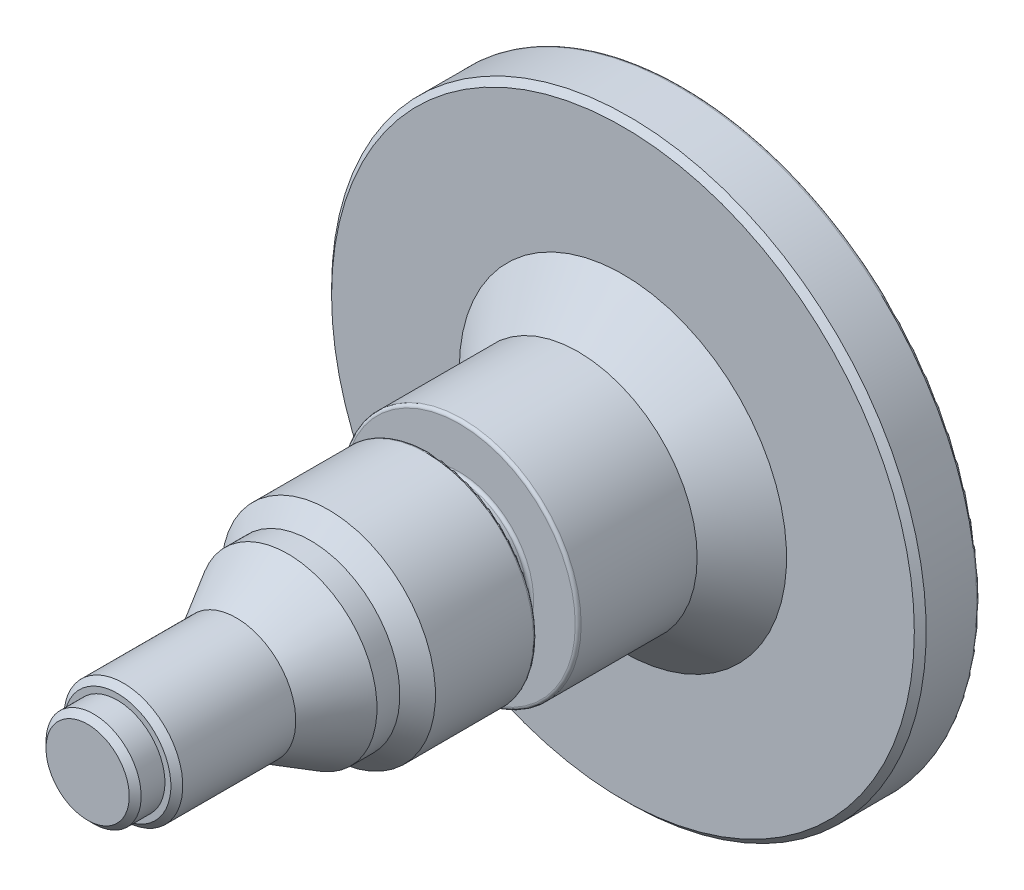
ISO-10303-21;
HEADER;
FILE_DESCRIPTION(('STEP AP214'),'2;1');
FILE_NAME('part.step','',(''),(''),'','','');
FILE_SCHEMA(('AUTOMOTIVE_DESIGN { 1 0 10303 214 1 1 1 1 }'));
ENDSEC;
DATA;
#1=APPLICATION_CONTEXT('core data for automotive mechanical design processes');
#2=APPLICATION_PROTOCOL_DEFINITION('international standard','automotive_design',2000,#1);
#3=PRODUCT_CONTEXT('',#1,'mechanical');
#4=PRODUCT('Part','Part','',(#3));
#5=PRODUCT_RELATED_PRODUCT_CATEGORY('part','',(#4));
#6=PRODUCT_DEFINITION_FORMATION('','',#4);
#7=PRODUCT_DEFINITION_CONTEXT('part definition',#1,'design');
#8=PRODUCT_DEFINITION('design','',#6,#7);
#9=PRODUCT_DEFINITION_SHAPE('','',#8);
#10=(LENGTH_UNIT() NAMED_UNIT(*) SI_UNIT(.MILLI.,.METRE.));
#11=(NAMED_UNIT(*) PLANE_ANGLE_UNIT() SI_UNIT($,.RADIAN.));
#12=(NAMED_UNIT(*) SI_UNIT($,.STERADIAN.) SOLID_ANGLE_UNIT());
#13=UNCERTAINTY_MEASURE_WITH_UNIT(LENGTH_MEASURE(1.E-05),#10,'distance_accuracy_value','');
#14=(GEOMETRIC_REPRESENTATION_CONTEXT(3) GLOBAL_UNCERTAINTY_ASSIGNED_CONTEXT((#13)) GLOBAL_UNIT_ASSIGNED_CONTEXT((#10,
#11,#12)) REPRESENTATION_CONTEXT('',''));
#15=CARTESIAN_POINT('',(0.,0.,0.));
#16=DIRECTION('',(0.,0.,1.));
#17=DIRECTION('',(1.,0.,0.));
#18=AXIS2_PLACEMENT_3D('',#15,#16,#17);
#19=CARTESIAN_POINT('',(3.49113099540333E-13,0.,-100.020445287201));
#20=DIRECTION('',(0.,0.,1.));
#21=DIRECTION('',(1.,0.,0.));
#22=AXIS2_PLACEMENT_3D('',#19,#20,#21);
#23=PLANE('',#22);
#24=CARTESIAN_POINT('',(3.49113099540333E-13,0.,-100.020445287201));
#25=DIRECTION('',(0.,0.,1.));
#26=DIRECTION('',(1.,0.,0.));
#27=AXIS2_PLACEMENT_3D('',#24,#25,#26);
#28=CIRCLE('',#27,49.4999985079314);
#29=CARTESIAN_POINT('',(49.4999985079318,0.,-100.0204452872));
#30=VERTEX_POINT('',#29);
#31=EDGE_CURVE('E70',#30,#30,#28,.F.);
#32=ORIENTED_EDGE('',*,*,#31,.T.);
#33=EDGE_LOOP('',(#32));
#34=FACE_BOUND('',#33,.T.);
#35=ADVANCED_FACE('F35',(#34),#23,.F.);
#36=CARTESIAN_POINT('',(3.49113099540332E-13,0.,-100.020445287201));
#37=DIRECTION('',(0.,0.,-1.));
#38=DIRECTION('',(-1.,0.,0.));
#39=AXIS2_PLACEMENT_3D('',#36,#37,#38);
#40=CYLINDRICAL_SURFACE('',#39,49.9999985079314);
#41=CARTESIAN_POINT('',(3.47367890855559E-13,0.,-99.5204452872006));
#42=DIRECTION('',(0.,0.,1.));
#43=DIRECTION('',(1.,0.,0.));
#44=AXIS2_PLACEMENT_3D('',#41,#42,#43);
#45=CIRCLE('',#44,49.9999985079314);
#46=CARTESIAN_POINT('',(49.9999985079318,0.,-99.5204452872004));
#47=VERTEX_POINT('',#46);
#48=EDGE_CURVE('E67',#47,#47,#45,.T.);
#49=ORIENTED_EDGE('',*,*,#48,.T.);
#50=EDGE_LOOP('',(#49));
#51=FACE_BOUND('',#50,.T.);
#52=CARTESIAN_POINT('',(3.17699348422347E-13,0.,-91.0204467792693));
#53=DIRECTION('',(0.,0.,-1.));
#54=DIRECTION('',(-1.,0.,0.));
#55=AXIS2_PLACEMENT_3D('',#52,#53,#54);
#56=CIRCLE('',#55,49.9999985079314);
#57=CARTESIAN_POINT('',(-49.9999985079311,0.,-91.0204467792695));
#58=VERTEX_POINT('',#57);
#59=EDGE_CURVE('E76',#58,#58,#56,.T.);
#60=ORIENTED_EDGE('',*,*,#59,.T.);
#61=EDGE_LOOP('',(#60));
#62=FACE_BOUND('',#61,.T.);
#63=ADVANCED_FACE('F131',(#51,#62),#40,.T.);
#64=CARTESIAN_POINT('',(49.9999970158631,0.,-90.0204452872005));
#65=DIRECTION('',(0.,0.,-1.));
#66=DIRECTION('',(-1.,0.,0.));
#67=AXIS2_PLACEMENT_3D('',#64,#65,#66);
#68=PLANE('',#67);
#69=CARTESIAN_POINT('',(3.14208925844857E-13,0.,-90.0204452872007));
#70=DIRECTION('',(0.,0.,-1.));
#71=DIRECTION('',(-1.,0.,0.));
#72=AXIS2_PLACEMENT_3D('',#69,#70,#71);
#73=CIRCLE('',#72,48.9999970158628);
#74=CARTESIAN_POINT('',(-48.9999970158624,0.,-90.0204452872009));
#75=VERTEX_POINT('',#74);
#76=EDGE_CURVE('E73',#75,#75,#73,.F.);
#77=ORIENTED_EDGE('',*,*,#76,.T.);
#78=EDGE_LOOP('',(#77));
#79=FACE_BOUND('',#78,.T.);
#80=CARTESIAN_POINT('',(3.14208925844857E-13,0.,-90.0204452872006));
#81=DIRECTION('',(0.,0.,-1.));
#82=DIRECTION('',(-1.,0.,0.));
#83=AXIS2_PLACEMENT_3D('',#80,#81,#82);
#84=CIRCLE('',#83,27.5204452872007);
#85=CARTESIAN_POINT('',(-27.5204452872003,0.,-90.0204452872007));
#86=VERTEX_POINT('',#85);
#87=EDGE_CURVE('E91',#86,#86,#84,.T.);
#88=ORIENTED_EDGE('',*,*,#87,.T.);
#89=EDGE_LOOP('',(#88));
#90=FACE_BOUND('',#89,.T.);
#91=ADVANCED_FACE('F137',(#79,#90),#68,.F.);
#92=CARTESIAN_POINT('',(2.87959432987679E-13,0.,-82.5));
#93=DIRECTION('',(0.,0.,-1.));
#94=DIRECTION('',(-1.,0.,0.));
#95=AXIS2_PLACEMENT_3D('',#92,#93,#94);
#96=CONICAL_SURFACE('',#95,20.,0.785398163397449);
#97=ORIENTED_EDGE('',*,*,#87,.F.);
#98=EDGE_LOOP('',(#97));
#99=FACE_BOUND('',#98,.T.);
#100=CARTESIAN_POINT('',(2.87959432987679E-13,0.,-82.5));
#101=DIRECTION('',(0.,0.,-1.));
#102=DIRECTION('',(-1.,0.,0.));
#103=AXIS2_PLACEMENT_3D('',#100,#101,#102);
#104=CIRCLE('',#103,20.);
#105=CARTESIAN_POINT('',(-19.9999999999997,0.,-82.5000000000001));
#106=VERTEX_POINT('',#105);
#107=EDGE_CURVE('E94',#106,#106,#104,.T.);
#108=ORIENTED_EDGE('',*,*,#107,.T.);
#109=EDGE_LOOP('',(#108));
#110=FACE_BOUND('',#109,.T.);
#111=ADVANCED_FACE('F197',(#99,#110),#96,.T.);
#112=CARTESIAN_POINT('',(3.49113099540332E-13,0.,-100.020445287201));
#113=DIRECTION('',(0.,0.,-1.));
#114=DIRECTION('',(-1.,0.,0.));
#115=AXIS2_PLACEMENT_3D('',#112,#113,#114);
#116=CYLINDRICAL_SURFACE('',#115,20.);
#117=CARTESIAN_POINT('',(2.198962942815E-13,0.,-63.));
#118=DIRECTION('',(0.,0.,-1.));
#119=DIRECTION('',(-1.,0.,0.));
#120=AXIS2_PLACEMENT_3D('',#117,#118,#119);
#121=CIRCLE('',#120,20.);
#122=CARTESIAN_POINT('',(-19.9999999999998,0.,-63.0000000000001));
#123=VERTEX_POINT('',#122);
#124=EDGE_CURVE('E10',#123,#123,#121,.T.);
#125=ORIENTED_EDGE('',*,*,#124,.T.);
#126=EDGE_LOOP('',(#125));
#127=FACE_BOUND('',#126,.T.);
#128=ORIENTED_EDGE('',*,*,#107,.F.);
#129=EDGE_LOOP('',(#128));
#130=FACE_BOUND('',#129,.T.);
#131=ADVANCED_FACE('F193',(#127,#130),#116,.T.);
#132=CARTESIAN_POINT('',(20.0000000000002,0.,-62.4999999999999));
#133=DIRECTION('',(0.,0.,-1.));
#134=DIRECTION('',(-1.,0.,0.));
#135=AXIS2_PLACEMENT_3D('',#132,#133,#134);
#136=PLANE('',#135);
#137=CARTESIAN_POINT('',(2.18151085596726E-13,0.,-62.5));
#138=DIRECTION('',(0.,0.,-1.));
#139=DIRECTION('',(-1.,0.,0.));
#140=AXIS2_PLACEMENT_3D('',#137,#138,#139);
#141=CIRCLE('',#140,12.5);
#142=CARTESIAN_POINT('',(-12.4999999999998,0.,-62.5));
#143=VERTEX_POINT('',#142);
#144=EDGE_CURVE('E46',#143,#143,#141,.T.);
#145=ORIENTED_EDGE('',*,*,#144,.T.);
#146=EDGE_LOOP('',(#145));
#147=FACE_BOUND('',#146,.T.);
#148=CARTESIAN_POINT('',(2.18151085596726E-13,0.,-62.5));
#149=DIRECTION('',(0.,0.,-1.));
#150=DIRECTION('',(-1.,0.,0.));
#151=AXIS2_PLACEMENT_3D('',#148,#149,#150);
#152=CIRCLE('',#151,19.5);
#153=CARTESIAN_POINT('',(-19.4999999999998,0.,-62.5000000000001));
#154=VERTEX_POINT('',#153);
#155=EDGE_CURVE('E50',#154,#154,#152,.F.);
#156=ORIENTED_EDGE('',*,*,#155,.T.);
#157=EDGE_LOOP('',(#156));
#158=FACE_BOUND('',#157,.T.);
#159=ADVANCED_FACE('F186',(#147,#158),#136,.F.);
#160=CARTESIAN_POINT('',(3.49113099540332E-13,0.,-100.020445287201));
#161=DIRECTION('',(0.,0.,-1.));
#162=DIRECTION('',(-1.,0.,0.));
#163=AXIS2_PLACEMENT_3D('',#160,#161,#162);
#164=CYLINDRICAL_SURFACE('',#163,12.);
#165=CARTESIAN_POINT('',(2.02444207433762E-13,0.,-58.));
#166=DIRECTION('',(0.,0.,1.));
#167=DIRECTION('',(1.,0.,0.));
#168=AXIS2_PLACEMENT_3D('',#165,#166,#167);
#169=CIRCLE('',#168,12.);
#170=CARTESIAN_POINT('',(12.0000000000002,0.,-58.));
#171=VERTEX_POINT('',#170);
#172=EDGE_CURVE('E61',#171,#171,#169,.F.);
#173=ORIENTED_EDGE('',*,*,#172,.T.);
#174=EDGE_LOOP('',(#173));
#175=FACE_BOUND('',#174,.T.);
#176=CARTESIAN_POINT('',(2.16405876911953E-13,0.,-62.));
#177=DIRECTION('',(0.,0.,-1.));
#178=DIRECTION('',(-1.,0.,0.));
#179=AXIS2_PLACEMENT_3D('',#176,#177,#178);
#180=CIRCLE('',#179,12.);
#181=CARTESIAN_POINT('',(-11.9999999999998,0.,-62.));
#182=VERTEX_POINT('',#181);
#183=EDGE_CURVE('E64',#182,#182,#180,.F.);
#184=ORIENTED_EDGE('',*,*,#183,.T.);
#185=EDGE_LOOP('',(#184));
#186=FACE_BOUND('',#185,.T.);
#187=ADVANCED_FACE('F177',(#175,#186),#164,.T.);
#188=CARTESIAN_POINT('',(12.0000000000002,0.,-57.5));
#189=DIRECTION('',(0.,0.,1.));
#190=DIRECTION('',(1.,0.,0.));
#191=AXIS2_PLACEMENT_3D('',#188,#189,#190);
#192=PLANE('',#191);
#193=CARTESIAN_POINT('',(2.00698998748988E-13,0.,-57.5));
#194=DIRECTION('',(0.,0.,1.));
#195=DIRECTION('',(1.,0.,0.));
#196=AXIS2_PLACEMENT_3D('',#193,#194,#195);
#197=CIRCLE('',#196,12.5);
#198=CARTESIAN_POINT('',(12.5000000000002,0.,-57.5));
#199=VERTEX_POINT('',#198);
#200=EDGE_CURVE('E55',#199,#199,#197,.T.);
#201=ORIENTED_EDGE('',*,*,#200,.T.);
#202=EDGE_LOOP('',(#201));
#203=FACE_BOUND('',#202,.T.);
#204=CARTESIAN_POINT('',(2.00698998748988E-13,0.,-57.5));
#205=DIRECTION('',(0.,0.,1.));
#206=DIRECTION('',(1.,0.,0.));
#207=AXIS2_PLACEMENT_3D('',#204,#205,#206);
#208=CIRCLE('',#207,17.4999999999999);
#209=CARTESIAN_POINT('',(17.5000000000001,0.,-57.4999999999999));
#210=VERTEX_POINT('',#209);
#211=EDGE_CURVE('E58',#210,#210,#208,.F.);
#212=ORIENTED_EDGE('',*,*,#211,.T.);
#213=EDGE_LOOP('',(#212));
#214=FACE_BOUND('',#213,.T.);
#215=ADVANCED_FACE('F174',(#203,#214),#192,.F.);
#216=CARTESIAN_POINT('',(3.49113099540332E-13,0.,-100.020445287201));
#217=DIRECTION('',(0.,0.,-1.));
#218=DIRECTION('',(-1.,0.,0.));
#219=AXIS2_PLACEMENT_3D('',#216,#217,#218);
#220=CYLINDRICAL_SURFACE('',#219,17.9999999999999);
#221=CARTESIAN_POINT('',(1.98953790064215E-13,0.,-57.));
#222=DIRECTION('',(0.,0.,1.));
#223=DIRECTION('',(1.,0.,0.));
#224=AXIS2_PLACEMENT_3D('',#221,#222,#223);
#225=CIRCLE('',#224,17.9999999999999);
#226=CARTESIAN_POINT('',(18.0000000000001,0.,-56.9999999999999));
#227=VERTEX_POINT('',#226);
#228=EDGE_CURVE('E42',#227,#227,#225,.T.);
#229=ORIENTED_EDGE('',*,*,#228,.T.);
#230=EDGE_LOOP('',(#229));
#231=FACE_BOUND('',#230,.T.);
#232=CARTESIAN_POINT('',(1.41361903466679E-13,0.,-40.5));
#233=DIRECTION('',(0.,0.,-1.));
#234=DIRECTION('',(-1.,0.,0.));
#235=AXIS2_PLACEMENT_3D('',#232,#233,#234);
#236=CIRCLE('',#235,17.9999999999999);
#237=CARTESIAN_POINT('',(-17.9999999999997,0.,-40.5000000000001));
#238=VERTEX_POINT('',#237);
#239=EDGE_CURVE('E97',#238,#238,#236,.T.);
#240=ORIENTED_EDGE('',*,*,#239,.T.);
#241=EDGE_LOOP('',(#240));
#242=FACE_BOUND('',#241,.T.);
#243=ADVANCED_FACE('F176',(#231,#242),#220,.T.);
#244=CARTESIAN_POINT('',(1.30890651358036E-13,0.,-37.5));
#245=DIRECTION('',(0.,0.,-1.));
#246=DIRECTION('',(-1.,0.,0.));
#247=AXIS2_PLACEMENT_3D('',#244,#245,#246);
#248=CONICAL_SURFACE('',#247,15.,0.785398163397426);
#249=ORIENTED_EDGE('',*,*,#239,.F.);
#250=EDGE_LOOP('',(#249));
#251=FACE_BOUND('',#250,.T.);
#252=CARTESIAN_POINT('',(1.30890651358036E-13,0.,-37.5));
#253=DIRECTION('',(0.,0.,-1.));
#254=DIRECTION('',(-1.,0.,0.));
#255=AXIS2_PLACEMENT_3D('',#252,#253,#254);
#256=CIRCLE('',#255,15.);
#257=CARTESIAN_POINT('',(-14.9999999999998,0.,-37.5));
#258=VERTEX_POINT('',#257);
#259=EDGE_CURVE('E100',#258,#258,#256,.T.);
#260=ORIENTED_EDGE('',*,*,#259,.T.);
#261=EDGE_LOOP('',(#260));
#262=FACE_BOUND('',#261,.T.);
#263=ADVANCED_FACE('F184',(#251,#262),#248,.T.);
#264=CARTESIAN_POINT('',(3.49113099540332E-13,0.,-100.020445287201));
#265=DIRECTION('',(0.,0.,-1.));
#266=DIRECTION('',(-1.,0.,0.));
#267=AXIS2_PLACEMENT_3D('',#264,#265,#266);
#268=CYLINDRICAL_SURFACE('',#267,15.0000000000001);
#269=ORIENTED_EDGE('',*,*,#259,.F.);
#270=EDGE_LOOP('',(#269));
#271=FACE_BOUND('',#270,.T.);
#272=CARTESIAN_POINT('',(1.17488335357077E-13,0.,-33.6602540378443));
#273=DIRECTION('',(0.,0.,-1.));
#274=DIRECTION('',(-1.,0.,0.));
#275=AXIS2_PLACEMENT_3D('',#272,#273,#274);
#276=CIRCLE('',#275,15.0000000000002);
#277=CARTESIAN_POINT('',(-15.0000000000001,0.,-33.6602540378444));
#278=VERTEX_POINT('',#277);
#279=EDGE_CURVE('E103',#278,#278,#276,.T.);
#280=ORIENTED_EDGE('',*,*,#279,.T.);
#281=EDGE_LOOP('',(#280));
#282=FACE_BOUND('',#281,.T.);
#283=ADVANCED_FACE('F320',(#271,#282),#268,.T.);
#284=CARTESIAN_POINT('',(0.,0.,-25.));
#285=DIRECTION('',(0.,0.,-1.));
#286=DIRECTION('',(-1.,0.,0.));
#287=AXIS2_PLACEMENT_3D('',#284,#285,#286);
#288=CONICAL_SURFACE('',#287,10.,0.52359877559832);
#289=ORIENTED_EDGE('',*,*,#279,.F.);
#290=EDGE_LOOP('',(#289));
#291=FACE_BOUND('',#290,.T.);
#292=CARTESIAN_POINT('',(0.,0.,-25.));
#293=DIRECTION('',(0.,0.,-1.));
#294=DIRECTION('',(-1.,0.,0.));
#295=AXIS2_PLACEMENT_3D('',#292,#293,#294);
#296=CIRCLE('',#295,10.);
#297=CARTESIAN_POINT('',(-9.99999999999991,0.,-25.));
#298=VERTEX_POINT('',#297);
#299=EDGE_CURVE('E106',#298,#298,#296,.T.);
#300=ORIENTED_EDGE('',*,*,#299,.T.);
#301=EDGE_LOOP('',(#300));
#302=FACE_BOUND('',#301,.T.);
#303=ADVANCED_FACE('F310',(#291,#302),#288,.T.);
#304=CARTESIAN_POINT('',(3.49113099540332E-13,0.,-100.020445287201));
#305=DIRECTION('',(0.,0.,-1.));
#306=DIRECTION('',(-1.,0.,0.));
#307=AXIS2_PLACEMENT_3D('',#304,#305,#306);
#308=CYLINDRICAL_SURFACE('',#307,10.);
#309=CARTESIAN_POINT('',(0.,0.,-6.00000000000002));
#310=DIRECTION('',(0.,0.,-1.));
#311=DIRECTION('',(-1.,0.,0.));
#312=AXIS2_PLACEMENT_3D('',#309,#310,#311);
#313=CIRCLE('',#312,10.);
#314=CARTESIAN_POINT('',(-9.99999999999998,0.,-6.00000000000005));
#315=VERTEX_POINT('',#314);
#316=EDGE_CURVE('E88',#315,#315,#313,.T.);
#317=ORIENTED_EDGE('',*,*,#316,.T.);
#318=EDGE_LOOP('',(#317));
#319=FACE_BOUND('',#318,.T.);
#320=ORIENTED_EDGE('',*,*,#299,.F.);
#321=EDGE_LOOP('',(#320));
#322=FACE_BOUND('',#321,.T.);
#323=ADVANCED_FACE('F127',(#319,#322),#308,.T.);
#324=CARTESIAN_POINT('',(10.,0.,-4.99999999999996));
#325=DIRECTION('',(0.,0.,-1.));
#326=DIRECTION('',(-1.,0.,0.));
#327=AXIS2_PLACEMENT_3D('',#324,#325,#326);
#328=PLANE('',#327);
#329=CARTESIAN_POINT('',(0.,0.,-5.));
#330=DIRECTION('',(0.,0.,-1.));
#331=DIRECTION('',(-1.,0.,0.));
#332=AXIS2_PLACEMENT_3D('',#329,#330,#331);
#333=CIRCLE('',#332,8.99999999999995);
#334=CARTESIAN_POINT('',(-8.99999999999993,0.,-5.00000000000003));
#335=VERTEX_POINT('',#334);
#336=EDGE_CURVE('E85',#335,#335,#333,.F.);
#337=ORIENTED_EDGE('',*,*,#336,.T.);
#338=EDGE_LOOP('',(#337));
#339=FACE_BOUND('',#338,.T.);
#340=CARTESIAN_POINT('',(0.,0.,-5.));
#341=DIRECTION('',(0.,0.,-1.));
#342=DIRECTION('',(-1.,0.,0.));
#343=AXIS2_PLACEMENT_3D('',#340,#341,#342);
#344=CIRCLE('',#343,8.);
#345=CARTESIAN_POINT('',(-7.99999999999998,0.,-5.00000000000003));
#346=VERTEX_POINT('',#345);
#347=EDGE_CURVE('E109',#346,#346,#344,.T.);
#348=ORIENTED_EDGE('',*,*,#347,.T.);
#349=EDGE_LOOP('',(#348));
#350=FACE_BOUND('',#349,.T.);
#351=ADVANCED_FACE('F113',(#339,#350),#328,.F.);
#352=CARTESIAN_POINT('',(3.49113099540332E-13,0.,-100.020445287201));
#353=DIRECTION('',(0.,0.,-1.));
#354=DIRECTION('',(-1.,0.,0.));
#355=AXIS2_PLACEMENT_3D('',#352,#353,#354);
#356=CYLINDRICAL_SURFACE('',#355,8.);
#357=CARTESIAN_POINT('',(0.,0.,-0.999999999999945));
#358=DIRECTION('',(0.,0.,-1.));
#359=DIRECTION('',(-1.,0.,0.));
#360=AXIS2_PLACEMENT_3D('',#357,#358,#359);
#361=CIRCLE('',#360,8.);
#362=CARTESIAN_POINT('',(-8.,0.,-0.999999999999973));
#363=VERTEX_POINT('',#362);
#364=EDGE_CURVE('E82',#363,#363,#361,.T.);
#365=ORIENTED_EDGE('',*,*,#364,.T.);
#366=EDGE_LOOP('',(#365));
#367=FACE_BOUND('',#366,.T.);
#368=ORIENTED_EDGE('',*,*,#347,.F.);
#369=EDGE_LOOP('',(#368));
#370=FACE_BOUND('',#369,.T.);
#371=ADVANCED_FACE('F115',(#367,#370),#356,.T.);
#372=CARTESIAN_POINT('',(8.,0.,0.));
#373=DIRECTION('',(0.,0.,-1.));
#374=DIRECTION('',(-1.,0.,0.));
#375=AXIS2_PLACEMENT_3D('',#372,#373,#374);
#376=PLANE('',#375);
#377=CARTESIAN_POINT('',(0.,0.,0.));
#378=DIRECTION('',(0.,0.,-1.));
#379=DIRECTION('',(-1.,0.,0.));
#380=AXIS2_PLACEMENT_3D('',#377,#378,#379);
#381=CIRCLE('',#380,7.00000000000004);
#382=CARTESIAN_POINT('',(-7.00000000000004,0.,0.));
#383=VERTEX_POINT('',#382);
#384=EDGE_CURVE('E79',#383,#383,#381,.F.);
#385=ORIENTED_EDGE('',*,*,#384,.T.);
#386=EDGE_LOOP('',(#385));
#387=FACE_BOUND('',#386,.T.);
#388=ADVANCED_FACE('F117',(#387),#376,.F.);
#389=CARTESIAN_POINT('',(0.,0.,-6.00000000000003));
#390=DIRECTION('',(0.,0.,-1.));
#391=DIRECTION('',(-1.,0.,0.));
#392=AXIS2_PLACEMENT_3D('',#389,#390,#391);
#393=CONICAL_SURFACE('',#392,10.,0.785398163397456);
#394=ORIENTED_EDGE('',*,*,#336,.F.);
#395=EDGE_LOOP('',(#394));
#396=FACE_BOUND('',#395,.T.);
#397=ORIENTED_EDGE('',*,*,#316,.F.);
#398=EDGE_LOOP('',(#397));
#399=FACE_BOUND('',#398,.T.);
#400=ADVANCED_FACE('F124',(#396,#399),#393,.T.);
#401=CARTESIAN_POINT('',(0.,0.,-0.999999999999945));
#402=DIRECTION('',(0.,0.,-1.));
#403=DIRECTION('',(-1.,0.,0.));
#404=AXIS2_PLACEMENT_3D('',#401,#402,#403);
#405=CONICAL_SURFACE('',#404,8.,0.785398163397458);
#406=ORIENTED_EDGE('',*,*,#384,.F.);
#407=EDGE_LOOP('',(#406));
#408=FACE_BOUND('',#407,.T.);
#409=ORIENTED_EDGE('',*,*,#364,.F.);
#410=EDGE_LOOP('',(#409));
#411=FACE_BOUND('',#410,.T.);
#412=ADVANCED_FACE('F144',(#408,#411),#405,.T.);
#413=CARTESIAN_POINT('',(3.17699348422347E-13,0.,-91.0204467792693));
#414=DIRECTION('',(0.,0.,-1.));
#415=DIRECTION('',(-1.,0.,0.));
#416=AXIS2_PLACEMENT_3D('',#413,#414,#415);
#417=CONICAL_SURFACE('',#416,49.9999985079314,0.785398163397469);
#418=ORIENTED_EDGE('',*,*,#76,.F.);
#419=EDGE_LOOP('',(#418));
#420=FACE_BOUND('',#419,.T.);
#421=ORIENTED_EDGE('',*,*,#59,.F.);
#422=EDGE_LOOP('',(#421));
#423=FACE_BOUND('',#422,.T.);
#424=ADVANCED_FACE('F148',(#420,#423),#417,.T.);
#425=CARTESIAN_POINT('',(3.47367890855559E-13,0.,-99.5204452872006));
#426=DIRECTION('',(0.,0.,1.));
#427=DIRECTION('',(1.,0.,0.));
#428=AXIS2_PLACEMENT_3D('',#425,#426,#427);
#429=TOROIDAL_SURFACE('',#428,49.4999985079314,0.5);
#430=ORIENTED_EDGE('',*,*,#48,.F.);
#431=EDGE_LOOP('',(#430));
#432=FACE_BOUND('',#431,.T.);
#433=ORIENTED_EDGE('',*,*,#31,.F.);
#434=EDGE_LOOP('',(#433));
#435=FACE_BOUND('',#434,.T.);
#436=ADVANCED_FACE('F152',(#432,#435),#429,.T.);
#437=CARTESIAN_POINT('',(2.02444207433762E-13,0.,-58.));
#438=DIRECTION('',(0.,0.,1.));
#439=DIRECTION('',(1.,0.,0.));
#440=AXIS2_PLACEMENT_3D('',#437,#438,#439);
#441=TOROIDAL_SURFACE('',#440,12.5,0.5);
#442=ORIENTED_EDGE('',*,*,#200,.F.);
#443=EDGE_LOOP('',(#442));
#444=FACE_BOUND('',#443,.T.);
#445=ORIENTED_EDGE('',*,*,#172,.F.);
#446=EDGE_LOOP('',(#445));
#447=FACE_BOUND('',#446,.T.);
#448=ADVANCED_FACE('F156',(#444,#447),#441,.F.);
#449=CARTESIAN_POINT('',(2.16405876911953E-13,0.,-62.));
#450=DIRECTION('',(0.,0.,-1.));
#451=DIRECTION('',(-1.,0.,0.));
#452=AXIS2_PLACEMENT_3D('',#449,#450,#451);
#453=TOROIDAL_SURFACE('',#452,12.5,0.5);
#454=ORIENTED_EDGE('',*,*,#183,.F.);
#455=EDGE_LOOP('',(#454));
#456=FACE_BOUND('',#455,.T.);
#457=ORIENTED_EDGE('',*,*,#144,.F.);
#458=EDGE_LOOP('',(#457));
#459=FACE_BOUND('',#458,.T.);
#460=ADVANCED_FACE('F160',(#456,#459),#453,.F.);
#461=CARTESIAN_POINT('',(1.98953790064215E-13,0.,-57.));
#462=DIRECTION('',(0.,0.,1.));
#463=DIRECTION('',(1.,0.,0.));
#464=AXIS2_PLACEMENT_3D('',#461,#462,#463);
#465=TOROIDAL_SURFACE('',#464,17.4999999999999,0.5);
#466=ORIENTED_EDGE('',*,*,#228,.F.);
#467=EDGE_LOOP('',(#466));
#468=FACE_BOUND('',#467,.T.);
#469=ORIENTED_EDGE('',*,*,#211,.F.);
#470=EDGE_LOOP('',(#469));
#471=FACE_BOUND('',#470,.T.);
#472=ADVANCED_FACE('F163',(#468,#471),#465,.T.);
#473=CARTESIAN_POINT('',(2.198962942815E-13,0.,-63.));
#474=DIRECTION('',(0.,0.,-1.));
#475=DIRECTION('',(-1.,0.,0.));
#476=AXIS2_PLACEMENT_3D('',#473,#474,#475);
#477=TOROIDAL_SURFACE('',#476,19.5,0.5);
#478=ORIENTED_EDGE('',*,*,#155,.F.);
#479=EDGE_LOOP('',(#478));
#480=FACE_BOUND('',#479,.T.);
#481=ORIENTED_EDGE('',*,*,#124,.F.);
#482=EDGE_LOOP('',(#481));
#483=FACE_BOUND('',#482,.T.);
#484=ADVANCED_FACE('F37',(#480,#483),#477,.T.);
#485=CLOSED_SHELL('',(#35,#63,#91,#111,#131,#159,#187,#215,#243,#263,#283,#303,#323,#351,#371,
#388,#400,#412,#424,#436,#448,#460,#472,#484));
#486=MANIFOLD_SOLID_BREP('B2',#485);
#487=ADVANCED_BREP_SHAPE_REPRESENTATION('',(#18,#486),#14);
#488=SHAPE_DEFINITION_REPRESENTATION(#9,#487);
ENDSEC;
END-ISO-10303-21;
